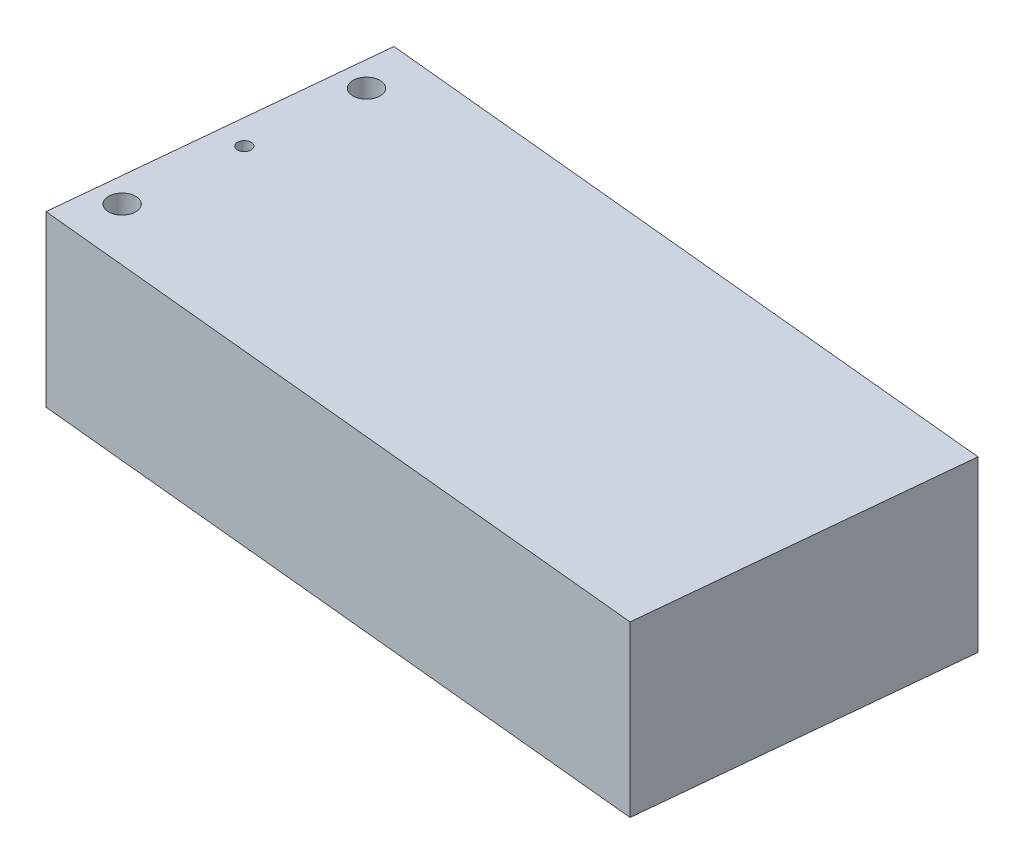
ISO-10303-21;
HEADER;
FILE_DESCRIPTION(('STEP AP214'),'2;1');
FILE_NAME('part.step','',(''),(''),'','','');
FILE_SCHEMA(('AUTOMOTIVE_DESIGN { 1 0 10303 214 1 1 1 1 }'));
ENDSEC;
DATA;
#1=APPLICATION_CONTEXT('core data for automotive mechanical design processes');
#2=APPLICATION_PROTOCOL_DEFINITION('international standard','automotive_design',2000,#1);
#3=PRODUCT_CONTEXT('',#1,'mechanical');
#4=PRODUCT('Part','Part','',(#3));
#5=PRODUCT_RELATED_PRODUCT_CATEGORY('part','',(#4));
#6=PRODUCT_DEFINITION_FORMATION('','',#4);
#7=PRODUCT_DEFINITION_CONTEXT('part definition',#1,'design');
#8=PRODUCT_DEFINITION('design','',#6,#7);
#9=PRODUCT_DEFINITION_SHAPE('','',#8);
#10=(LENGTH_UNIT() NAMED_UNIT(*) SI_UNIT(.MILLI.,.METRE.));
#11=(NAMED_UNIT(*) PLANE_ANGLE_UNIT() SI_UNIT($,.RADIAN.));
#12=(NAMED_UNIT(*) SI_UNIT($,.STERADIAN.) SOLID_ANGLE_UNIT());
#13=UNCERTAINTY_MEASURE_WITH_UNIT(LENGTH_MEASURE(1.E-05),#10,'distance_accuracy_value','');
#14=(GEOMETRIC_REPRESENTATION_CONTEXT(3) GLOBAL_UNCERTAINTY_ASSIGNED_CONTEXT((#13)) GLOBAL_UNIT_ASSIGNED_CONTEXT((#10,
#11,#12)) REPRESENTATION_CONTEXT('',''));
#15=CARTESIAN_POINT('',(0.,0.,0.));
#16=DIRECTION('',(0.,0.,1.));
#17=DIRECTION('',(1.,0.,0.));
#18=AXIS2_PLACEMENT_3D('',#15,#16,#17);
#19=CARTESIAN_POINT('',(0.,25.,0.));
#20=DIRECTION('',(0.,-1.,0.));
#21=DIRECTION('',(0.,0.,-1.));
#22=AXIS2_PLACEMENT_3D('',#19,#20,#21);
#23=PLANE('',#22);
#24=CARTESIAN_POINT('',(7.87516530375889,25.,-39.4205754833497));
#25=DIRECTION('',(0.,1.,0.));
#26=DIRECTION('',(0.,0.,1.));
#27=AXIS2_PLACEMENT_3D('',#24,#25,#26);
#28=CIRCLE('',#27,2.);
#29=CARTESIAN_POINT('',(7.87516530375889,25.,-37.4205754833497));
#30=VERTEX_POINT('',#29);
#31=EDGE_CURVE('E116',#30,#30,#28,.T.);
#32=ORIENTED_EDGE('',*,*,#31,.F.);
#33=EDGE_LOOP('',(#32));
#34=FACE_BOUND('',#33,.T.);
#35=DIRECTION('',(-0.0973541523619787,0.,0.99524980231994));
#36=VECTOR('',#35,1.);
#37=CARTESIAN_POINT('',(0.,25.,0.));
#38=LINE('',#37,#36);
#39=CARTESIAN_POINT('',(4.575645161013,25.,-46.7767407090372));
#40=VERTEX_POINT('',#39);
#41=CARTESIAN_POINT('',(0.,25.,0.));
#42=VERTEX_POINT('',#41);
#43=EDGE_CURVE('E86',#40,#42,#38,.T.);
#44=ORIENTED_EDGE('',*,*,#43,.T.);
#45=DIRECTION('',(0.995249802319941,0.,0.0973541523619782));
#46=VECTOR('',#45,1.);
#47=CARTESIAN_POINT('',(0.,25.,0.));
#48=LINE('',#47,#46);
#49=CARTESIAN_POINT('',(95.5439810227143,25.,9.3459986267499));
#50=VERTEX_POINT('',#49);
#51=EDGE_CURVE('E81',#42,#50,#48,.T.);
#52=ORIENTED_EDGE('',*,*,#51,.T.);
#53=DIRECTION('',(0.0973541523619783,0.,-0.99524980231994));
#54=VECTOR('',#53,1.);
#55=CARTESIAN_POINT('',(95.5439810227143,25.,9.3459986267499));
#56=LINE('',#55,#54);
#57=CARTESIAN_POINT('',(100.119626183727,25.,-37.4307420822873));
#58=VERTEX_POINT('',#57);
#59=EDGE_CURVE('E84',#50,#58,#56,.T.);
#60=ORIENTED_EDGE('',*,*,#59,.T.);
#61=DIRECTION('',(-0.995249802319941,0.,-0.097354152361978));
#62=VECTOR('',#61,1.);
#63=CARTESIAN_POINT('',(4.575645161013,25.,-46.7767407090372));
#64=LINE('',#63,#62);
#65=EDGE_CURVE('E51',#58,#40,#64,.T.);
#66=ORIENTED_EDGE('',*,*,#65,.T.);
#67=EDGE_LOOP('',(#44,#52,#60,#66));
#68=FACE_BOUND('',#67,.T.);
#69=CARTESIAN_POINT('',(4.66247827581361,25.,-6.57733200679167));
#70=DIRECTION('',(0.,1.,0.));
#71=DIRECTION('',(0.,0.,1.));
#72=AXIS2_PLACEMENT_3D('',#69,#70,#71);
#73=CIRCLE('',#72,2.);
#74=CARTESIAN_POINT('',(4.66247827581361,25.,-4.57733200679167));
#75=VERTEX_POINT('',#74);
#76=EDGE_CURVE('E101',#75,#75,#73,.T.);
#77=ORIENTED_EDGE('',*,*,#76,.F.);
#78=EDGE_LOOP('',(#77));
#79=FACE_BOUND('',#78,.T.);
#80=CARTESIAN_POINT('',(6.26882178978625,25.,-22.9989537450707));
#81=DIRECTION('',(0.,1.,0.));
#82=DIRECTION('',(0.,0.,1.));
#83=AXIS2_PLACEMENT_3D('',#80,#81,#82);
#84=CIRCLE('',#83,1.);
#85=CARTESIAN_POINT('',(6.26882178978625,25.,-21.9989537450707));
#86=VERTEX_POINT('',#85);
#87=EDGE_CURVE('E122',#86,#86,#84,.T.);
#88=ORIENTED_EDGE('',*,*,#87,.F.);
#89=EDGE_LOOP('',(#88));
#90=FACE_BOUND('',#89,.T.);
#91=ADVANCED_FACE('F34',(#34,#68,#79,#90),#23,.F.);
#92=CARTESIAN_POINT('',(0.,0.,0.));
#93=DIRECTION('',(0.,-1.,0.));
#94=DIRECTION('',(0.,0.,-1.));
#95=AXIS2_PLACEMENT_3D('',#92,#93,#94);
#96=PLANE('',#95);
#97=CARTESIAN_POINT('',(7.87516530375889,0.,-39.4205754833497));
#98=DIRECTION('',(0.,1.,0.));
#99=DIRECTION('',(0.,0.,1.));
#100=AXIS2_PLACEMENT_3D('',#97,#98,#99);
#101=CIRCLE('',#100,2.);
#102=CARTESIAN_POINT('',(7.87516530375889,0.,-37.4205754833497));
#103=VERTEX_POINT('',#102);
#104=EDGE_CURVE('E119',#103,#103,#101,.T.);
#105=ORIENTED_EDGE('',*,*,#104,.T.);
#106=EDGE_LOOP('',(#105));
#107=FACE_BOUND('',#106,.T.);
#108=DIRECTION('',(-0.0973541523619787,0.,0.99524980231994));
#109=VECTOR('',#108,1.);
#110=CARTESIAN_POINT('',(0.,0.,0.));
#111=LINE('',#110,#109);
#112=CARTESIAN_POINT('',(4.575645161013,0.,-46.7767407090372));
#113=VERTEX_POINT('',#112);
#114=CARTESIAN_POINT('',(0.,0.,0.));
#115=VERTEX_POINT('',#114);
#116=EDGE_CURVE('E98',#113,#115,#111,.T.);
#117=ORIENTED_EDGE('',*,*,#116,.F.);
#118=DIRECTION('',(-0.995249802319941,0.,-0.097354152361978));
#119=VECTOR('',#118,1.);
#120=CARTESIAN_POINT('',(4.575645161013,0.,-46.7767407090372));
#121=LINE('',#120,#119);
#122=CARTESIAN_POINT('',(100.119626183727,0.,-37.4307420822873));
#123=VERTEX_POINT('',#122);
#124=EDGE_CURVE('E74',#123,#113,#121,.T.);
#125=ORIENTED_EDGE('',*,*,#124,.F.);
#126=DIRECTION('',(0.0973541523619783,0.,-0.99524980231994));
#127=VECTOR('',#126,1.);
#128=CARTESIAN_POINT('',(95.5439810227143,0.,9.3459986267499));
#129=LINE('',#128,#127);
#130=CARTESIAN_POINT('',(95.5439810227143,0.,9.3459986267499));
#131=VERTEX_POINT('',#130);
#132=EDGE_CURVE('E68',#131,#123,#129,.T.);
#133=ORIENTED_EDGE('',*,*,#132,.F.);
#134=DIRECTION('',(0.995249802319941,0.,0.0973541523619782));
#135=VECTOR('',#134,1.);
#136=CARTESIAN_POINT('',(0.,0.,0.));
#137=LINE('',#136,#135);
#138=EDGE_CURVE('E90',#115,#131,#137,.T.);
#139=ORIENTED_EDGE('',*,*,#138,.F.);
#140=EDGE_LOOP('',(#117,#125,#133,#139));
#141=FACE_BOUND('',#140,.T.);
#142=CARTESIAN_POINT('',(4.66247827581361,0.,-6.57733200679167));
#143=DIRECTION('',(0.,1.,0.));
#144=DIRECTION('',(0.,0.,1.));
#145=AXIS2_PLACEMENT_3D('',#142,#143,#144);
#146=CIRCLE('',#145,2.);
#147=CARTESIAN_POINT('',(4.66247827581361,0.,-4.57733200679167));
#148=VERTEX_POINT('',#147);
#149=EDGE_CURVE('E113',#148,#148,#146,.T.);
#150=ORIENTED_EDGE('',*,*,#149,.T.);
#151=EDGE_LOOP('',(#150));
#152=FACE_BOUND('',#151,.T.);
#153=CARTESIAN_POINT('',(6.26882178978625,0.,-22.9989537450707));
#154=DIRECTION('',(0.,1.,0.));
#155=DIRECTION('',(0.,0.,1.));
#156=AXIS2_PLACEMENT_3D('',#153,#154,#155);
#157=CIRCLE('',#156,1.);
#158=CARTESIAN_POINT('',(6.26882178978625,0.,-21.9989537450707));
#159=VERTEX_POINT('',#158);
#160=EDGE_CURVE('E125',#159,#159,#157,.T.);
#161=ORIENTED_EDGE('',*,*,#160,.T.);
#162=EDGE_LOOP('',(#161));
#163=FACE_BOUND('',#162,.T.);
#164=ADVANCED_FACE('F109',(#107,#141,#152,#163),#96,.T.);
#165=CARTESIAN_POINT('',(0.,25.,0.));
#166=DIRECTION('',(0.995249802319941,0.,0.0973541523619787));
#167=DIRECTION('',(0.0973541523619787,0.,-0.995249802319941));
#168=AXIS2_PLACEMENT_3D('',#165,#166,#167);
#169=PLANE('',#168);
#170=ORIENTED_EDGE('',*,*,#116,.T.);
#171=DIRECTION('',(0.,-1.,0.));
#172=VECTOR('',#171,1.);
#173=CARTESIAN_POINT('',(0.,25.,0.));
#174=LINE('',#173,#172);
#175=EDGE_CURVE('E11',#42,#115,#174,.T.);
#176=ORIENTED_EDGE('',*,*,#175,.F.);
#177=ORIENTED_EDGE('',*,*,#43,.F.);
#178=DIRECTION('',(0.,-1.,0.));
#179=VECTOR('',#178,1.);
#180=CARTESIAN_POINT('',(4.575645161013,25.,-46.7767407090372));
#181=LINE('',#180,#179);
#182=EDGE_CURVE('E94',#40,#113,#181,.T.);
#183=ORIENTED_EDGE('',*,*,#182,.T.);
#184=EDGE_LOOP('',(#170,#176,#177,#183));
#185=FACE_BOUND('',#184,.T.);
#186=ADVANCED_FACE('F36',(#185),#169,.F.);
#187=CARTESIAN_POINT('',(0.,25.,0.));
#188=DIRECTION('',(0.0973541523619781,0.,-0.99524980231994));
#189=DIRECTION('',(-0.995249802319941,0.,-0.0973541523619782));
#190=AXIS2_PLACEMENT_3D('',#187,#188,#189);
#191=PLANE('',#190);
#192=ORIENTED_EDGE('',*,*,#138,.T.);
#193=DIRECTION('',(0.,-1.,0.));
#194=VECTOR('',#193,1.);
#195=CARTESIAN_POINT('',(95.5439810227143,25.,9.3459986267499));
#196=LINE('',#195,#194);
#197=EDGE_CURVE('E43',#50,#131,#196,.T.);
#198=ORIENTED_EDGE('',*,*,#197,.F.);
#199=ORIENTED_EDGE('',*,*,#51,.F.);
#200=ORIENTED_EDGE('',*,*,#175,.T.);
#201=EDGE_LOOP('',(#192,#198,#199,#200));
#202=FACE_BOUND('',#201,.T.);
#203=ADVANCED_FACE('F89',(#202),#191,.F.);
#204=CARTESIAN_POINT('',(95.5439810227143,25.,9.3459986267499));
#205=DIRECTION('',(-0.995249802319941,0.,-0.0973541523619783));
#206=DIRECTION('',(-0.0973541523619783,0.,0.995249802319941));
#207=AXIS2_PLACEMENT_3D('',#204,#205,#206);
#208=PLANE('',#207);
#209=ORIENTED_EDGE('',*,*,#132,.T.);
#210=DIRECTION('',(0.,-1.,0.));
#211=VECTOR('',#210,1.);
#212=CARTESIAN_POINT('',(100.119626183727,25.,-37.4307420822873));
#213=LINE('',#212,#211);
#214=EDGE_CURVE('E91',#58,#123,#213,.T.);
#215=ORIENTED_EDGE('',*,*,#214,.F.);
#216=ORIENTED_EDGE('',*,*,#59,.F.);
#217=ORIENTED_EDGE('',*,*,#197,.T.);
#218=EDGE_LOOP('',(#209,#215,#216,#217));
#219=FACE_BOUND('',#218,.T.);
#220=ADVANCED_FACE('F92',(#219),#208,.F.);
#221=CARTESIAN_POINT('',(4.575645161013,25.,-46.7767407090372));
#222=DIRECTION('',(-0.097354152361978,0.,0.99524980231994));
#223=DIRECTION('',(0.995249802319941,0.,0.097354152361978));
#224=AXIS2_PLACEMENT_3D('',#221,#222,#223);
#225=PLANE('',#224);
#226=ORIENTED_EDGE('',*,*,#124,.T.);
#227=ORIENTED_EDGE('',*,*,#182,.F.);
#228=ORIENTED_EDGE('',*,*,#65,.F.);
#229=ORIENTED_EDGE('',*,*,#214,.T.);
#230=EDGE_LOOP('',(#226,#227,#228,#229));
#231=FACE_BOUND('',#230,.T.);
#232=ADVANCED_FACE('F106',(#231),#225,.F.);
#233=CARTESIAN_POINT('',(4.66247827581361,25.,-6.57733200679167));
#234=DIRECTION('',(0.,-1.,0.));
#235=DIRECTION('',(0.,0.,-1.));
#236=AXIS2_PLACEMENT_3D('',#233,#234,#235);
#237=CYLINDRICAL_SURFACE('',#236,2.);
#238=ORIENTED_EDGE('',*,*,#76,.T.);
#239=EDGE_LOOP('',(#238));
#240=FACE_BOUND('',#239,.T.);
#241=ORIENTED_EDGE('',*,*,#149,.F.);
#242=EDGE_LOOP('',(#241));
#243=FACE_BOUND('',#242,.T.);
#244=ADVANCED_FACE('F144',(#240,#243),#237,.F.);
#245=CARTESIAN_POINT('',(7.87516530375889,25.,-39.4205754833497));
#246=DIRECTION('',(0.,-1.,0.));
#247=DIRECTION('',(0.,0.,-1.));
#248=AXIS2_PLACEMENT_3D('',#245,#246,#247);
#249=CYLINDRICAL_SURFACE('',#248,2.);
#250=ORIENTED_EDGE('',*,*,#31,.T.);
#251=EDGE_LOOP('',(#250));
#252=FACE_BOUND('',#251,.T.);
#253=ORIENTED_EDGE('',*,*,#104,.F.);
#254=EDGE_LOOP('',(#253));
#255=FACE_BOUND('',#254,.T.);
#256=ADVANCED_FACE('F190',(#252,#255),#249,.F.);
#257=CARTESIAN_POINT('',(6.26882178978625,25.,-22.9989537450707));
#258=DIRECTION('',(0.,-1.,0.));
#259=DIRECTION('',(0.,0.,-1.));
#260=AXIS2_PLACEMENT_3D('',#257,#258,#259);
#261=CYLINDRICAL_SURFACE('',#260,1.);
#262=ORIENTED_EDGE('',*,*,#87,.T.);
#263=EDGE_LOOP('',(#262));
#264=FACE_BOUND('',#263,.T.);
#265=ORIENTED_EDGE('',*,*,#160,.F.);
#266=EDGE_LOOP('',(#265));
#267=FACE_BOUND('',#266,.T.);
#268=ADVANCED_FACE('F131',(#264,#267),#261,.F.);
#269=CLOSED_SHELL('',(#91,#164,#186,#203,#220,#232,#244,#256,#268));
#270=MANIFOLD_SOLID_BREP('B2',#269);
#271=ADVANCED_BREP_SHAPE_REPRESENTATION('',(#18,#270),#14);
#272=SHAPE_DEFINITION_REPRESENTATION(#9,#271);
ENDSEC;
END-ISO-10303-21;
